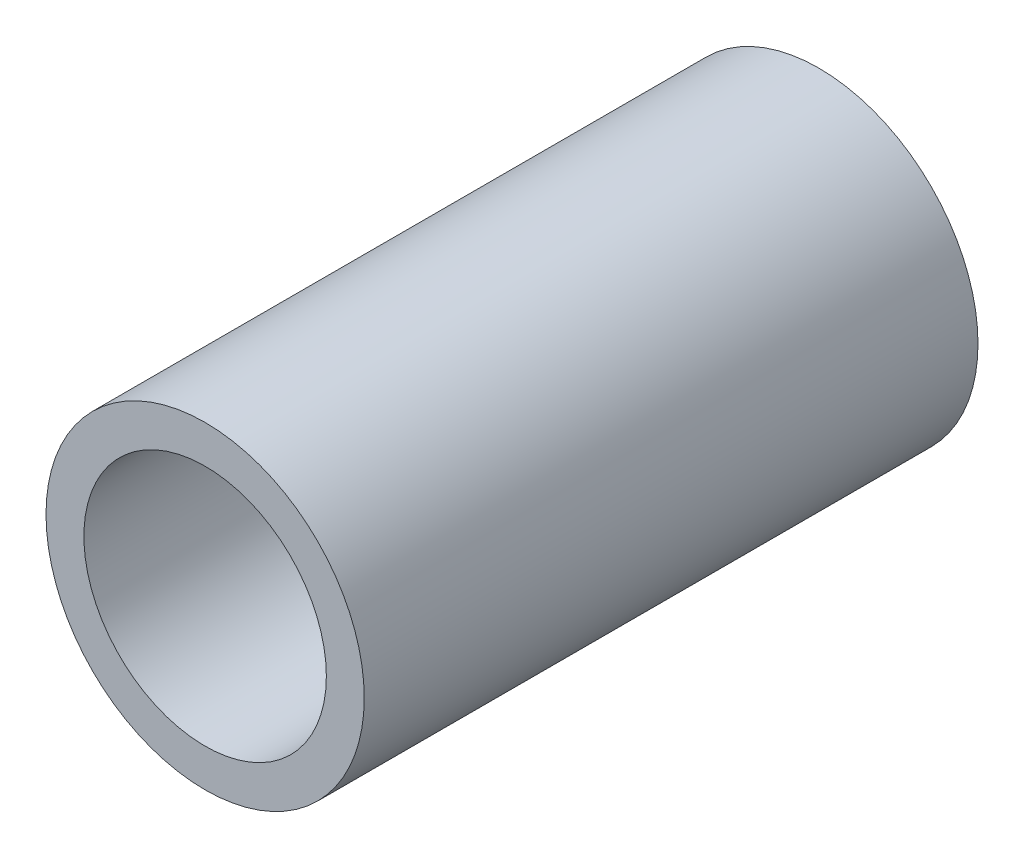
ISO-10303-21;
HEADER;
FILE_DESCRIPTION(('STEP AP214'),'2;1');
FILE_NAME('part.step','',(''),(''),'','','');
FILE_SCHEMA(('AUTOMOTIVE_DESIGN { 1 0 10303 214 1 1 1 1 }'));
ENDSEC;
DATA;
#1=APPLICATION_CONTEXT('core data for automotive mechanical design processes');
#2=APPLICATION_PROTOCOL_DEFINITION('international standard','automotive_design',2000,#1);
#3=PRODUCT_CONTEXT('',#1,'mechanical');
#4=PRODUCT('Part','Part','',(#3));
#5=PRODUCT_RELATED_PRODUCT_CATEGORY('part','',(#4));
#6=PRODUCT_DEFINITION_FORMATION('','',#4);
#7=PRODUCT_DEFINITION_CONTEXT('part definition',#1,'design');
#8=PRODUCT_DEFINITION('design','',#6,#7);
#9=PRODUCT_DEFINITION_SHAPE('','',#8);
#10=(LENGTH_UNIT() NAMED_UNIT(*) SI_UNIT(.MILLI.,.METRE.));
#11=(NAMED_UNIT(*) PLANE_ANGLE_UNIT() SI_UNIT($,.RADIAN.));
#12=(NAMED_UNIT(*) SI_UNIT($,.STERADIAN.) SOLID_ANGLE_UNIT());
#13=UNCERTAINTY_MEASURE_WITH_UNIT(LENGTH_MEASURE(1.E-05),#10,'distance_accuracy_value','');
#14=(GEOMETRIC_REPRESENTATION_CONTEXT(3) GLOBAL_UNCERTAINTY_ASSIGNED_CONTEXT((#13)) GLOBAL_UNIT_ASSIGNED_CONTEXT((#10,
#11,#12)) REPRESENTATION_CONTEXT('',''));
#15=CARTESIAN_POINT('',(0.,0.,0.));
#16=DIRECTION('',(0.,0.,1.));
#17=DIRECTION('',(1.,0.,0.));
#18=AXIS2_PLACEMENT_3D('',#15,#16,#17);
#19=CARTESIAN_POINT('',(0.,0.,2.05740000000001));
#20=DIRECTION('',(0.,0.,1.));
#21=DIRECTION('',(1.,0.,0.));
#22=AXIS2_PLACEMENT_3D('',#19,#20,#21);
#23=PLANE('',#22);
#24=CARTESIAN_POINT('',(0.,0.,2.05740000000001));
#25=DIRECTION('',(0.,0.,1.));
#26=DIRECTION('',(1.,0.,0.));
#27=AXIS2_PLACEMENT_3D('',#24,#25,#26);
#28=CIRCLE('',#27,0.5334);
#29=CARTESIAN_POINT('',(0.533400000000028,0.,2.05740000000001));
#30=VERTEX_POINT('',#29);
#31=EDGE_CURVE('E10',#30,#30,#28,.T.);
#32=ORIENTED_EDGE('',*,*,#31,.T.);
#33=EDGE_LOOP('',(#32));
#34=FACE_BOUND('',#33,.T.);
#35=CARTESIAN_POINT('',(0.,0.,2.05740000000001));
#36=DIRECTION('',(0.,0.,1.));
#37=DIRECTION('',(1.,0.,0.));
#38=AXIS2_PLACEMENT_3D('',#35,#36,#37);
#39=CIRCLE('',#38,0.4064);
#40=CARTESIAN_POINT('',(0.406400000000028,0.,2.05740000000001));
#41=VERTEX_POINT('',#40);
#42=EDGE_CURVE('E57',#41,#41,#39,.T.);
#43=ORIENTED_EDGE('',*,*,#42,.F.);
#44=EDGE_LOOP('',(#43));
#45=FACE_BOUND('',#44,.T.);
#46=ADVANCED_FACE('F43',(#34,#45),#23,.T.);
#47=CARTESIAN_POINT('',(0.,0.,0.));
#48=DIRECTION('',(0.,0.,1.));
#49=DIRECTION('',(1.,0.,0.));
#50=AXIS2_PLACEMENT_3D('',#47,#48,#49);
#51=PLANE('',#50);
#52=CARTESIAN_POINT('',(0.,0.,0.));
#53=DIRECTION('',(0.,0.,1.));
#54=DIRECTION('',(1.,0.,0.));
#55=AXIS2_PLACEMENT_3D('',#52,#53,#54);
#56=CIRCLE('',#55,0.5334);
#57=CARTESIAN_POINT('',(0.5334,0.,0.));
#58=VERTEX_POINT('',#57);
#59=EDGE_CURVE('E47',#58,#58,#56,.T.);
#60=ORIENTED_EDGE('',*,*,#59,.F.);
#61=EDGE_LOOP('',(#60));
#62=FACE_BOUND('',#61,.T.);
#63=CARTESIAN_POINT('',(0.,0.,0.));
#64=DIRECTION('',(0.,0.,1.));
#65=DIRECTION('',(1.,0.,0.));
#66=AXIS2_PLACEMENT_3D('',#63,#64,#65);
#67=CIRCLE('',#66,0.4064);
#68=CARTESIAN_POINT('',(0.4064,0.,0.));
#69=VERTEX_POINT('',#68);
#70=EDGE_CURVE('E59',#69,#69,#67,.T.);
#71=ORIENTED_EDGE('',*,*,#70,.T.);
#72=EDGE_LOOP('',(#71));
#73=FACE_BOUND('',#72,.T.);
#74=ADVANCED_FACE('F72',(#62,#73),#51,.F.);
#75=CARTESIAN_POINT('',(0.,0.,2.05740000000001));
#76=DIRECTION('',(0.,0.,-1.));
#77=DIRECTION('',(-1.,0.,0.));
#78=AXIS2_PLACEMENT_3D('',#75,#76,#77);
#79=CYLINDRICAL_SURFACE('',#78,0.5334);
#80=ORIENTED_EDGE('',*,*,#31,.F.);
#81=EDGE_LOOP('',(#80));
#82=FACE_BOUND('',#81,.T.);
#83=ORIENTED_EDGE('',*,*,#59,.T.);
#84=EDGE_LOOP('',(#83));
#85=FACE_BOUND('',#84,.T.);
#86=ADVANCED_FACE('F45',(#82,#85),#79,.T.);
#87=CARTESIAN_POINT('',(0.,0.,2.05740000000001));
#88=DIRECTION('',(0.,0.,-1.));
#89=DIRECTION('',(-1.,0.,0.));
#90=AXIS2_PLACEMENT_3D('',#87,#88,#89);
#91=CYLINDRICAL_SURFACE('',#90,0.4064);
#92=ORIENTED_EDGE('',*,*,#42,.T.);
#93=EDGE_LOOP('',(#92));
#94=FACE_BOUND('',#93,.T.);
#95=ORIENTED_EDGE('',*,*,#70,.F.);
#96=EDGE_LOOP('',(#95));
#97=FACE_BOUND('',#96,.T.);
#98=ADVANCED_FACE('F68',(#94,#97),#91,.F.);
#99=CLOSED_SHELL('',(#46,#74,#86,#98));
#100=MANIFOLD_SOLID_BREP('B2',#99);
#101=ADVANCED_BREP_SHAPE_REPRESENTATION('',(#18,#100),#14);
#102=SHAPE_DEFINITION_REPRESENTATION(#9,#101);
ENDSEC;
END-ISO-10303-21;
